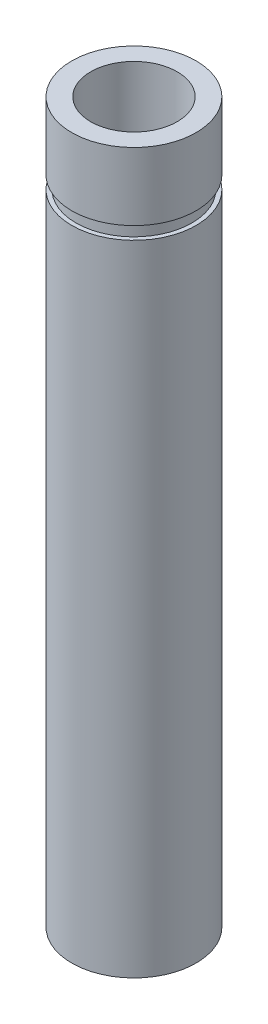
ISO-10303-21;
HEADER;
FILE_DESCRIPTION(('STEP AP214'),'2;1');
FILE_NAME('part.step','',(''),(''),'','','');
FILE_SCHEMA(('AUTOMOTIVE_DESIGN { 1 0 10303 214 1 1 1 1 }'));
ENDSEC;
DATA;
#1=APPLICATION_CONTEXT('core data for automotive mechanical design processes');
#2=APPLICATION_PROTOCOL_DEFINITION('international standard','automotive_design',2000,#1);
#3=PRODUCT_CONTEXT('',#1,'mechanical');
#4=PRODUCT('Part','Part','',(#3));
#5=PRODUCT_RELATED_PRODUCT_CATEGORY('part','',(#4));
#6=PRODUCT_DEFINITION_FORMATION('','',#4);
#7=PRODUCT_DEFINITION_CONTEXT('part definition',#1,'design');
#8=PRODUCT_DEFINITION('design','',#6,#7);
#9=PRODUCT_DEFINITION_SHAPE('','',#8);
#10=(LENGTH_UNIT() NAMED_UNIT(*) SI_UNIT(.MILLI.,.METRE.));
#11=(NAMED_UNIT(*) PLANE_ANGLE_UNIT() SI_UNIT($,.RADIAN.));
#12=(NAMED_UNIT(*) SI_UNIT($,.STERADIAN.) SOLID_ANGLE_UNIT());
#13=UNCERTAINTY_MEASURE_WITH_UNIT(LENGTH_MEASURE(1.E-05),#10,'distance_accuracy_value','');
#14=(GEOMETRIC_REPRESENTATION_CONTEXT(3) GLOBAL_UNCERTAINTY_ASSIGNED_CONTEXT((#13)) GLOBAL_UNIT_ASSIGNED_CONTEXT((#10,
#11,#12)) REPRESENTATION_CONTEXT('',''));
#15=CARTESIAN_POINT('',(0.,0.,0.));
#16=DIRECTION('',(0.,0.,1.));
#17=DIRECTION('',(1.,0.,0.));
#18=AXIS2_PLACEMENT_3D('',#15,#16,#17);
#19=CARTESIAN_POINT('',(-13.9198704769737,33.4765625,0.));
#20=DIRECTION('',(0.,1.,0.));
#21=DIRECTION('',(-1.,0.,0.));
#22=AXIS2_PLACEMENT_3D('',#19,#20,#21);
#23=CYLINDRICAL_SURFACE('',#22,14.7);
#24=CARTESIAN_POINT('',(-13.9198704769738,-136.5234375,0.));
#25=DIRECTION('',(0.,1.,0.));
#26=DIRECTION('',(-1.,0.,0.));
#27=AXIS2_PLACEMENT_3D('',#24,#25,#26);
#28=CIRCLE('',#27,14.7);
#29=CARTESIAN_POINT('',(-28.6198704769738,-136.5234375,0.));
#30=VERTEX_POINT('',#29);
#31=EDGE_CURVE('E56',#30,#30,#28,.T.);
#32=ORIENTED_EDGE('',*,*,#31,.T.);
#33=EDGE_LOOP('',(#32));
#34=FACE_BOUND('',#33,.T.);
#35=CARTESIAN_POINT('',(-13.9198704769737,14.4765625,0.));
#36=DIRECTION('',(0.,1.,0.));
#37=DIRECTION('',(0.,0.,1.));
#38=AXIS2_PLACEMENT_3D('',#35,#36,#37);
#39=CIRCLE('',#38,14.7);
#40=CARTESIAN_POINT('',(-13.9198704769737,14.4765625,14.7));
#41=VERTEX_POINT('',#40);
#42=EDGE_CURVE('E59',#41,#41,#39,.T.);
#43=ORIENTED_EDGE('',*,*,#42,.F.);
#44=EDGE_LOOP('',(#43));
#45=FACE_BOUND('',#44,.T.);
#46=ADVANCED_FACE('F41',(#34,#45),#23,.T.);
#47=CARTESIAN_POINT('',(-13.9198704769737,33.4765625,0.));
#48=DIRECTION('',(0.,1.,0.));
#49=DIRECTION('',(-1.,0.,0.));
#50=AXIS2_PLACEMENT_3D('',#47,#48,#49);
#51=CIRCLE('',#50,14.7);
#52=CARTESIAN_POINT('',(-28.6198704769738,33.4765625,0.));
#53=VERTEX_POINT('',#52);
#54=EDGE_CURVE('E52',#53,#53,#51,.T.);
#55=ORIENTED_EDGE('',*,*,#54,.F.);
#56=EDGE_LOOP('',(#55));
#57=FACE_BOUND('',#56,.T.);
#58=CARTESIAN_POINT('',(-13.9198704769737,17.4765625,0.));
#59=DIRECTION('',(0.,1.,0.));
#60=DIRECTION('',(0.,0.,1.));
#61=AXIS2_PLACEMENT_3D('',#58,#59,#60);
#62=CIRCLE('',#61,14.7);
#63=CARTESIAN_POINT('',(-13.9198704769737,17.4765625,14.7));
#64=VERTEX_POINT('',#63);
#65=EDGE_CURVE('E68',#64,#64,#62,.T.);
#66=ORIENTED_EDGE('',*,*,#65,.T.);
#67=EDGE_LOOP('',(#66));
#68=FACE_BOUND('',#67,.T.);
#69=ADVANCED_FACE('F72',(#57,#68),#23,.T.);
#70=CARTESIAN_POINT('',(-13.9198704769738,33.4765625,0.));
#71=DIRECTION('',(0.,1.,0.));
#72=DIRECTION('',(0.,0.,1.));
#73=AXIS2_PLACEMENT_3D('',#70,#71,#72);
#74=PLANE('',#73);
#75=CARTESIAN_POINT('',(-13.9198704769738,33.4765625,0.));
#76=DIRECTION('',(0.,1.,0.));
#77=DIRECTION('',(0.,0.,1.));
#78=AXIS2_PLACEMENT_3D('',#75,#76,#77);
#79=CIRCLE('',#78,10.23);
#80=CARTESIAN_POINT('',(-13.9198704769738,33.4765625,10.23));
#81=VERTEX_POINT('',#80);
#82=EDGE_CURVE('E11',#81,#81,#79,.T.);
#83=ORIENTED_EDGE('',*,*,#82,.F.);
#84=EDGE_LOOP('',(#83));
#85=FACE_BOUND('',#84,.T.);
#86=ORIENTED_EDGE('',*,*,#54,.T.);
#87=EDGE_LOOP('',(#86));
#88=FACE_BOUND('',#87,.T.);
#89=ADVANCED_FACE('F91',(#85,#88),#74,.T.);
#90=CARTESIAN_POINT('',(-13.9198704769738,-136.5234375,0.));
#91=DIRECTION('',(0.,1.,0.));
#92=DIRECTION('',(0.,0.,1.));
#93=AXIS2_PLACEMENT_3D('',#90,#91,#92);
#94=PLANE('',#93);
#95=CARTESIAN_POINT('',(-13.9198704769738,-136.5234375,0.));
#96=DIRECTION('',(0.,1.,0.));
#97=DIRECTION('',(0.,0.,1.));
#98=AXIS2_PLACEMENT_3D('',#95,#96,#97);
#99=CIRCLE('',#98,10.23);
#100=CARTESIAN_POINT('',(-13.9198704769738,-136.5234375,10.23));
#101=VERTEX_POINT('',#100);
#102=EDGE_CURVE('E45',#101,#101,#99,.T.);
#103=ORIENTED_EDGE('',*,*,#102,.T.);
#104=EDGE_LOOP('',(#103));
#105=FACE_BOUND('',#104,.T.);
#106=ORIENTED_EDGE('',*,*,#31,.F.);
#107=EDGE_LOOP('',(#106));
#108=FACE_BOUND('',#107,.T.);
#109=ADVANCED_FACE('F97',(#105,#108),#94,.F.);
#110=CARTESIAN_POINT('',(-13.9198704769738,33.4765625,0.));
#111=DIRECTION('',(0.,-1.,0.));
#112=DIRECTION('',(0.,0.,-1.));
#113=AXIS2_PLACEMENT_3D('',#110,#111,#112);
#114=CYLINDRICAL_SURFACE('',#113,10.23);
#115=ORIENTED_EDGE('',*,*,#82,.T.);
#116=EDGE_LOOP('',(#115));
#117=FACE_BOUND('',#116,.T.);
#118=ORIENTED_EDGE('',*,*,#102,.F.);
#119=EDGE_LOOP('',(#118));
#120=FACE_BOUND('',#119,.T.);
#121=ADVANCED_FACE('F43',(#117,#120),#114,.F.);
#122=CARTESIAN_POINT('',(0.780129523026262,14.4765625,0.));
#123=DIRECTION('',(0.,1.,0.));
#124=DIRECTION('',(0.,0.,1.));
#125=AXIS2_PLACEMENT_3D('',#122,#123,#124);
#126=PLANE('',#125);
#127=ORIENTED_EDGE('',*,*,#42,.T.);
#128=EDGE_LOOP('',(#127));
#129=FACE_BOUND('',#128,.T.);
#130=CARTESIAN_POINT('',(-13.9198704769737,14.4765625,0.));
#131=DIRECTION('',(0.,1.,0.));
#132=DIRECTION('',(0.,0.,1.));
#133=AXIS2_PLACEMENT_3D('',#130,#131,#132);
#134=CIRCLE('',#133,13.7);
#135=CARTESIAN_POINT('',(-13.9198704769737,14.4765625,13.7));
#136=VERTEX_POINT('',#135);
#137=EDGE_CURVE('E62',#136,#136,#134,.T.);
#138=ORIENTED_EDGE('',*,*,#137,.F.);
#139=EDGE_LOOP('',(#138));
#140=FACE_BOUND('',#139,.T.);
#141=ADVANCED_FACE('F82',(#129,#140),#126,.T.);
#142=CARTESIAN_POINT('',(-13.9198704769737,33.4765625,0.));
#143=DIRECTION('',(0.,1.,0.));
#144=DIRECTION('',(0.,0.,1.));
#145=AXIS2_PLACEMENT_3D('',#142,#143,#144);
#146=CYLINDRICAL_SURFACE('',#145,13.7);
#147=ORIENTED_EDGE('',*,*,#137,.T.);
#148=EDGE_LOOP('',(#147));
#149=FACE_BOUND('',#148,.T.);
#150=CARTESIAN_POINT('',(-13.9198704769737,17.4765625,0.));
#151=DIRECTION('',(0.,1.,0.));
#152=DIRECTION('',(0.,0.,1.));
#153=AXIS2_PLACEMENT_3D('',#150,#151,#152);
#154=CIRCLE('',#153,13.7);
#155=CARTESIAN_POINT('',(-13.9198704769737,17.4765625,13.7));
#156=VERTEX_POINT('',#155);
#157=EDGE_CURVE('E65',#156,#156,#154,.T.);
#158=ORIENTED_EDGE('',*,*,#157,.F.);
#159=EDGE_LOOP('',(#158));
#160=FACE_BOUND('',#159,.T.);
#161=ADVANCED_FACE('F76',(#149,#160),#146,.T.);
#162=CARTESIAN_POINT('',(0.78012952302626,17.4765625,0.));
#163=DIRECTION('',(0.,-1.,0.));
#164=DIRECTION('',(0.,0.,-1.));
#165=AXIS2_PLACEMENT_3D('',#162,#163,#164);
#166=PLANE('',#165);
#167=ORIENTED_EDGE('',*,*,#157,.T.);
#168=EDGE_LOOP('',(#167));
#169=FACE_BOUND('',#168,.T.);
#170=ORIENTED_EDGE('',*,*,#65,.F.);
#171=EDGE_LOOP('',(#170));
#172=FACE_BOUND('',#171,.T.);
#173=ADVANCED_FACE('F74',(#169,#172),#166,.T.);
#174=CLOSED_SHELL('',(#46,#69,#89,#109,#121,#141,#161,#173));
#175=MANIFOLD_SOLID_BREP('B2',#174);
#176=ADVANCED_BREP_SHAPE_REPRESENTATION('',(#18,#175),#14);
#177=SHAPE_DEFINITION_REPRESENTATION(#9,#176);
ENDSEC;
END-ISO-10303-21;
